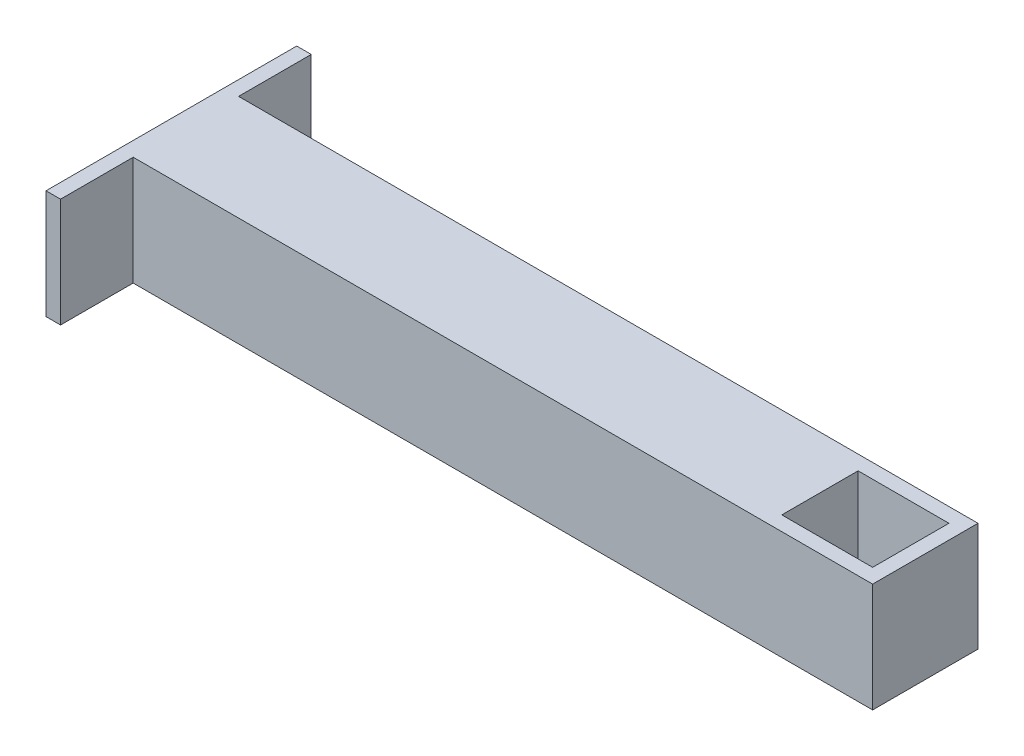
ISO-10303-21;
HEADER;
FILE_DESCRIPTION(('STEP AP214'),'2;1');
FILE_NAME('part.step','',(''),(''),'','','');
FILE_SCHEMA(('AUTOMOTIVE_DESIGN { 1 0 10303 214 1 1 1 1 }'));
ENDSEC;
DATA;
#1=APPLICATION_CONTEXT('core data for automotive mechanical design processes');
#2=APPLICATION_PROTOCOL_DEFINITION('international standard','automotive_design',2000,#1);
#3=PRODUCT_CONTEXT('',#1,'mechanical');
#4=PRODUCT('Part','Part','',(#3));
#5=PRODUCT_RELATED_PRODUCT_CATEGORY('part','',(#4));
#6=PRODUCT_DEFINITION_FORMATION('','',#4);
#7=PRODUCT_DEFINITION_CONTEXT('part definition',#1,'design');
#8=PRODUCT_DEFINITION('design','',#6,#7);
#9=PRODUCT_DEFINITION_SHAPE('','',#8);
#10=(LENGTH_UNIT() NAMED_UNIT(*) SI_UNIT(.MILLI.,.METRE.));
#11=(NAMED_UNIT(*) PLANE_ANGLE_UNIT() SI_UNIT($,.RADIAN.));
#12=(NAMED_UNIT(*) SI_UNIT($,.STERADIAN.) SOLID_ANGLE_UNIT());
#13=UNCERTAINTY_MEASURE_WITH_UNIT(LENGTH_MEASURE(1.E-05),#10,'distance_accuracy_value','');
#14=(GEOMETRIC_REPRESENTATION_CONTEXT(3) GLOBAL_UNCERTAINTY_ASSIGNED_CONTEXT((#13)) GLOBAL_UNIT_ASSIGNED_CONTEXT((#10,
#11,#12)) REPRESENTATION_CONTEXT('',''));
#15=CARTESIAN_POINT('',(0.,0.,0.));
#16=DIRECTION('',(0.,0.,1.));
#17=DIRECTION('',(1.,0.,0.));
#18=AXIS2_PLACEMENT_3D('',#15,#16,#17);
#19=CARTESIAN_POINT('',(-87.25,15.,0.));
#20=DIRECTION('',(-1.,0.,0.));
#21=DIRECTION('',(0.,0.,1.));
#22=AXIS2_PLACEMENT_3D('',#19,#20,#21);
#23=PLANE('',#22);
#24=DIRECTION('',(0.,0.,-1.));
#25=VECTOR('',#24,1.);
#26=CARTESIAN_POINT('',(-87.25,0.,0.));
#27=LINE('',#26,#25);
#28=CARTESIAN_POINT('',(-87.25,0.,22.5));
#29=VERTEX_POINT('',#28);
#30=CARTESIAN_POINT('',(-87.25,0.,12.5));
#31=VERTEX_POINT('',#30);
#32=EDGE_CURVE('E186',#29,#31,#27,.T.);
#33=ORIENTED_EDGE('',*,*,#32,.T.);
#34=DIRECTION('',(0.,-1.,0.));
#35=VECTOR('',#34,1.);
#36=CARTESIAN_POINT('',(-87.25,15.,12.5));
#37=LINE('',#36,#35);
#38=CARTESIAN_POINT('',(-87.25,15.,12.5));
#39=VERTEX_POINT('',#38);
#40=EDGE_CURVE('E11',#39,#31,#37,.T.);
#41=ORIENTED_EDGE('',*,*,#40,.F.);
#42=DIRECTION('',(0.,0.,-1.));
#43=VECTOR('',#42,1.);
#44=CARTESIAN_POINT('',(-87.25,15.,0.));
#45=LINE('',#44,#43);
#46=CARTESIAN_POINT('',(-87.25,15.,22.5));
#47=VERTEX_POINT('',#46);
#48=EDGE_CURVE('E305',#47,#39,#45,.T.);
#49=ORIENTED_EDGE('',*,*,#48,.F.);
#50=DIRECTION('',(0.,-1.,0.));
#51=VECTOR('',#50,1.);
#52=CARTESIAN_POINT('',(-87.25,15.,22.5));
#53=LINE('',#52,#51);
#54=EDGE_CURVE('E212',#47,#29,#53,.T.);
#55=ORIENTED_EDGE('',*,*,#54,.T.);
#56=EDGE_LOOP('',(#33,#41,#49,#55));
#57=FACE_BOUND('',#56,.T.);
#58=ADVANCED_FACE('F39',(#57),#23,.F.);
#59=CARTESIAN_POINT('',(0.,15.,12.5));
#60=DIRECTION('',(0.,0.,-1.));
#61=DIRECTION('',(-1.,0.,0.));
#62=AXIS2_PLACEMENT_3D('',#59,#60,#61);
#63=PLANE('',#62);
#64=DIRECTION('',(1.,0.,0.));
#65=VECTOR('',#64,1.);
#66=CARTESIAN_POINT('',(0.,0.,12.5));
#67=LINE('',#66,#65);
#68=CARTESIAN_POINT('',(14.5,0.,12.5));
#69=VERTEX_POINT('',#68);
#70=EDGE_CURVE('E190',#31,#69,#67,.T.);
#71=ORIENTED_EDGE('',*,*,#70,.T.);
#72=DIRECTION('',(0.,-1.,0.));
#73=VECTOR('',#72,1.);
#74=CARTESIAN_POINT('',(14.5,15.,12.5));
#75=LINE('',#74,#73);
#76=CARTESIAN_POINT('',(14.5,15.,12.5));
#77=VERTEX_POINT('',#76);
#78=EDGE_CURVE('E50',#77,#69,#75,.T.);
#79=ORIENTED_EDGE('',*,*,#78,.F.);
#80=DIRECTION('',(1.,0.,0.));
#81=VECTOR('',#80,1.);
#82=CARTESIAN_POINT('',(0.,15.,12.5));
#83=LINE('',#82,#81);
#84=EDGE_CURVE('E308',#39,#77,#83,.T.);
#85=ORIENTED_EDGE('',*,*,#84,.F.);
#86=ORIENTED_EDGE('',*,*,#40,.T.);
#87=EDGE_LOOP('',(#71,#79,#85,#86));
#88=FACE_BOUND('',#87,.T.);
#89=ADVANCED_FACE('F262',(#88),#63,.F.);
#90=CARTESIAN_POINT('',(14.5,15.,0.));
#91=DIRECTION('',(1.,0.,0.));
#92=DIRECTION('',(0.,0.,-1.));
#93=AXIS2_PLACEMENT_3D('',#90,#91,#92);
#94=PLANE('',#93);
#95=DIRECTION('',(0.,0.,1.));
#96=VECTOR('',#95,1.);
#97=CARTESIAN_POINT('',(14.5,0.,0.));
#98=LINE('',#97,#96);
#99=CARTESIAN_POINT('',(14.5,0.,-2.));
#100=VERTEX_POINT('',#99);
#101=EDGE_CURVE('E194',#100,#69,#98,.T.);
#102=ORIENTED_EDGE('',*,*,#101,.F.);
#103=DIRECTION('',(0.,-1.,0.));
#104=VECTOR('',#103,1.);
#105=CARTESIAN_POINT('',(14.5,15.,-2.));
#106=LINE('',#105,#104);
#107=CARTESIAN_POINT('',(14.5,15.,-2.));
#108=VERTEX_POINT('',#107);
#109=EDGE_CURVE('E222',#108,#100,#106,.T.);
#110=ORIENTED_EDGE('',*,*,#109,.F.);
#111=DIRECTION('',(0.,0.,1.));
#112=VECTOR('',#111,1.);
#113=CARTESIAN_POINT('',(14.5,15.,0.));
#114=LINE('',#113,#112);
#115=EDGE_CURVE('E311',#108,#77,#114,.T.);
#116=ORIENTED_EDGE('',*,*,#115,.T.);
#117=ORIENTED_EDGE('',*,*,#78,.T.);
#118=EDGE_LOOP('',(#102,#110,#116,#117));
#119=FACE_BOUND('',#118,.T.);
#120=ADVANCED_FACE('F268',(#119),#94,.T.);
#121=CARTESIAN_POINT('',(0.,15.,-2.));
#122=DIRECTION('',(0.,0.,-1.));
#123=DIRECTION('',(-1.,0.,0.));
#124=AXIS2_PLACEMENT_3D('',#121,#122,#123);
#125=PLANE('',#124);
#126=DIRECTION('',(1.,0.,0.));
#127=VECTOR('',#126,1.);
#128=CARTESIAN_POINT('',(0.,0.,-2.));
#129=LINE('',#128,#127);
#130=CARTESIAN_POINT('',(-87.25,0.,-2.00000000000001));
#131=VERTEX_POINT('',#130);
#132=EDGE_CURVE('E198',#131,#100,#129,.T.);
#133=ORIENTED_EDGE('',*,*,#132,.F.);
#134=DIRECTION('',(0.,-1.,0.));
#135=VECTOR('',#134,1.);
#136=CARTESIAN_POINT('',(-87.25,15.,-2.00000000000001));
#137=LINE('',#136,#135);
#138=CARTESIAN_POINT('',(-87.25,15.,-2.00000000000001));
#139=VERTEX_POINT('',#138);
#140=EDGE_CURVE('E219',#139,#131,#137,.T.);
#141=ORIENTED_EDGE('',*,*,#140,.F.);
#142=DIRECTION('',(1.,0.,0.));
#143=VECTOR('',#142,1.);
#144=CARTESIAN_POINT('',(0.,15.,-2.));
#145=LINE('',#144,#143);
#146=EDGE_CURVE('E315',#139,#108,#145,.T.);
#147=ORIENTED_EDGE('',*,*,#146,.T.);
#148=ORIENTED_EDGE('',*,*,#109,.T.);
#149=EDGE_LOOP('',(#133,#141,#147,#148));
#150=FACE_BOUND('',#149,.T.);
#151=ADVANCED_FACE('F274',(#150),#125,.T.);
#152=CARTESIAN_POINT('',(-87.25,15.,0.));
#153=DIRECTION('',(-1.,0.,0.));
#154=DIRECTION('',(0.,0.,1.));
#155=AXIS2_PLACEMENT_3D('',#152,#153,#154);
#156=PLANE('',#155);
#157=DIRECTION('',(0.,0.,-1.));
#158=VECTOR('',#157,1.);
#159=CARTESIAN_POINT('',(-87.25,0.,0.));
#160=LINE('',#159,#158);
#161=CARTESIAN_POINT('',(-87.25,0.,-12.));
#162=VERTEX_POINT('',#161);
#163=EDGE_CURVE('E202',#131,#162,#160,.T.);
#164=ORIENTED_EDGE('',*,*,#163,.T.);
#165=DIRECTION('',(0.,-1.,0.));
#166=VECTOR('',#165,1.);
#167=CARTESIAN_POINT('',(-87.25,15.,-12.));
#168=LINE('',#167,#166);
#169=CARTESIAN_POINT('',(-87.25,15.,-12.));
#170=VERTEX_POINT('',#169);
#171=EDGE_CURVE('E159',#170,#162,#168,.T.);
#172=ORIENTED_EDGE('',*,*,#171,.F.);
#173=DIRECTION('',(0.,0.,-1.));
#174=VECTOR('',#173,1.);
#175=CARTESIAN_POINT('',(-87.25,15.,0.));
#176=LINE('',#175,#174);
#177=EDGE_CURVE('E148',#139,#170,#176,.T.);
#178=ORIENTED_EDGE('',*,*,#177,.F.);
#179=ORIENTED_EDGE('',*,*,#140,.T.);
#180=EDGE_LOOP('',(#164,#172,#178,#179));
#181=FACE_BOUND('',#180,.T.);
#182=ADVANCED_FACE('F278',(#181),#156,.F.);
#183=CARTESIAN_POINT('',(0.,15.,-12.));
#184=DIRECTION('',(0.,0.,1.));
#185=DIRECTION('',(1.,0.,0.));
#186=AXIS2_PLACEMENT_3D('',#183,#184,#185);
#187=PLANE('',#186);
#188=DIRECTION('',(-1.,0.,0.));
#189=VECTOR('',#188,1.);
#190=CARTESIAN_POINT('',(0.,0.,-12.));
#191=LINE('',#190,#189);
#192=CARTESIAN_POINT('',(-89.25,0.,-12.));
#193=VERTEX_POINT('',#192);
#194=EDGE_CURVE('E157',#162,#193,#191,.T.);
#195=ORIENTED_EDGE('',*,*,#194,.T.);
#196=DIRECTION('',(0.,-1.,0.));
#197=VECTOR('',#196,1.);
#198=CARTESIAN_POINT('',(-89.25,15.,-12.));
#199=LINE('',#198,#197);
#200=CARTESIAN_POINT('',(-89.25,15.,-12.));
#201=VERTEX_POINT('',#200);
#202=EDGE_CURVE('E154',#201,#193,#199,.T.);
#203=ORIENTED_EDGE('',*,*,#202,.F.);
#204=DIRECTION('',(-1.,0.,0.));
#205=VECTOR('',#204,1.);
#206=CARTESIAN_POINT('',(0.,15.,-12.));
#207=LINE('',#206,#205);
#208=EDGE_CURVE('E141',#170,#201,#207,.T.);
#209=ORIENTED_EDGE('',*,*,#208,.F.);
#210=ORIENTED_EDGE('',*,*,#171,.T.);
#211=EDGE_LOOP('',(#195,#203,#209,#210));
#212=FACE_BOUND('',#211,.T.);
#213=ADVANCED_FACE('F155',(#212),#187,.F.);
#214=CARTESIAN_POINT('',(-89.25,15.,0.));
#215=DIRECTION('',(1.,0.,0.));
#216=DIRECTION('',(0.,0.,-1.));
#217=AXIS2_PLACEMENT_3D('',#214,#215,#216);
#218=PLANE('',#217);
#219=DIRECTION('',(0.,0.,1.));
#220=VECTOR('',#219,1.);
#221=CARTESIAN_POINT('',(-89.25,0.,0.));
#222=LINE('',#221,#220);
#223=CARTESIAN_POINT('',(-89.25,0.,22.5));
#224=VERTEX_POINT('',#223);
#225=EDGE_CURVE('E100',#193,#224,#222,.T.);
#226=ORIENTED_EDGE('',*,*,#225,.T.);
#227=DIRECTION('',(0.,-1.,0.));
#228=VECTOR('',#227,1.);
#229=CARTESIAN_POINT('',(-89.25,15.,22.5));
#230=LINE('',#229,#228);
#231=CARTESIAN_POINT('',(-89.25,15.,22.5));
#232=VERTEX_POINT('',#231);
#233=EDGE_CURVE('E160',#232,#224,#230,.T.);
#234=ORIENTED_EDGE('',*,*,#233,.F.);
#235=DIRECTION('',(0.,0.,1.));
#236=VECTOR('',#235,1.);
#237=CARTESIAN_POINT('',(-89.25,15.,0.));
#238=LINE('',#237,#236);
#239=EDGE_CURVE('E145',#201,#232,#238,.T.);
#240=ORIENTED_EDGE('',*,*,#239,.F.);
#241=ORIENTED_EDGE('',*,*,#202,.T.);
#242=EDGE_LOOP('',(#226,#234,#240,#241));
#243=FACE_BOUND('',#242,.T.);
#244=ADVANCED_FACE('F162',(#243),#218,.F.);
#245=CARTESIAN_POINT('',(0.,15.,0.));
#246=DIRECTION('',(0.,0.,-1.));
#247=DIRECTION('',(-1.,0.,0.));
#248=AXIS2_PLACEMENT_3D('',#245,#246,#247);
#249=PLANE('',#248);
#250=DIRECTION('',(1.,0.,0.));
#251=VECTOR('',#250,1.);
#252=CARTESIAN_POINT('',(0.,0.,0.));
#253=LINE('',#252,#251);
#254=CARTESIAN_POINT('',(0.,0.,0.));
#255=VERTEX_POINT('',#254);
#256=CARTESIAN_POINT('',(12.5,0.,0.));
#257=VERTEX_POINT('',#256);
#258=EDGE_CURVE('E170',#255,#257,#253,.T.);
#259=ORIENTED_EDGE('',*,*,#258,.T.);
#260=DIRECTION('',(0.,-1.,0.));
#261=VECTOR('',#260,1.);
#262=CARTESIAN_POINT('',(12.5,15.,0.));
#263=LINE('',#262,#261);
#264=CARTESIAN_POINT('',(12.5,15.,0.));
#265=VERTEX_POINT('',#264);
#266=EDGE_CURVE('E43',#265,#257,#263,.T.);
#267=ORIENTED_EDGE('',*,*,#266,.F.);
#268=DIRECTION('',(1.,0.,0.));
#269=VECTOR('',#268,1.);
#270=CARTESIAN_POINT('',(0.,15.,0.));
#271=LINE('',#270,#269);
#272=CARTESIAN_POINT('',(0.,15.,0.));
#273=VERTEX_POINT('',#272);
#274=EDGE_CURVE('E211',#273,#265,#271,.T.);
#275=ORIENTED_EDGE('',*,*,#274,.F.);
#276=DIRECTION('',(0.,-1.,0.));
#277=VECTOR('',#276,1.);
#278=CARTESIAN_POINT('',(0.,15.,0.));
#279=LINE('',#278,#277);
#280=EDGE_CURVE('E166',#273,#255,#279,.T.);
#281=ORIENTED_EDGE('',*,*,#280,.T.);
#282=EDGE_LOOP('',(#259,#267,#275,#281));
#283=FACE_BOUND('',#282,.T.);
#284=ADVANCED_FACE('F41',(#283),#249,.F.);
#285=CARTESIAN_POINT('',(12.5,15.,0.));
#286=DIRECTION('',(1.,0.,0.));
#287=DIRECTION('',(0.,0.,-1.));
#288=AXIS2_PLACEMENT_3D('',#285,#286,#287);
#289=PLANE('',#288);
#290=DIRECTION('',(0.,0.,1.));
#291=VECTOR('',#290,1.);
#292=CARTESIAN_POINT('',(12.5,0.,0.));
#293=LINE('',#292,#291);
#294=CARTESIAN_POINT('',(12.5,0.,10.5));
#295=VERTEX_POINT('',#294);
#296=EDGE_CURVE('E174',#257,#295,#293,.T.);
#297=ORIENTED_EDGE('',*,*,#296,.T.);
#298=DIRECTION('',(0.,-1.,0.));
#299=VECTOR('',#298,1.);
#300=CARTESIAN_POINT('',(12.5,15.,10.5));
#301=LINE('',#300,#299);
#302=CARTESIAN_POINT('',(12.5,15.,10.5));
#303=VERTEX_POINT('',#302);
#304=EDGE_CURVE('E231',#303,#295,#301,.T.);
#305=ORIENTED_EDGE('',*,*,#304,.F.);
#306=DIRECTION('',(0.,0.,1.));
#307=VECTOR('',#306,1.);
#308=CARTESIAN_POINT('',(12.5,15.,0.));
#309=LINE('',#308,#307);
#310=EDGE_CURVE('E115',#265,#303,#309,.T.);
#311=ORIENTED_EDGE('',*,*,#310,.F.);
#312=ORIENTED_EDGE('',*,*,#266,.T.);
#313=EDGE_LOOP('',(#297,#305,#311,#312));
#314=FACE_BOUND('',#313,.T.);
#315=ADVANCED_FACE('F238',(#314),#289,.F.);
#316=CARTESIAN_POINT('',(0.,15.,10.5));
#317=DIRECTION('',(0.,0.,-1.));
#318=DIRECTION('',(-1.,0.,0.));
#319=AXIS2_PLACEMENT_3D('',#316,#317,#318);
#320=PLANE('',#319);
#321=DIRECTION('',(1.,0.,0.));
#322=VECTOR('',#321,1.);
#323=CARTESIAN_POINT('',(0.,0.,10.5));
#324=LINE('',#323,#322);
#325=CARTESIAN_POINT('',(0.,0.,10.5));
#326=VERTEX_POINT('',#325);
#327=EDGE_CURVE('E178',#326,#295,#324,.T.);
#328=ORIENTED_EDGE('',*,*,#327,.F.);
#329=DIRECTION('',(0.,-1.,0.));
#330=VECTOR('',#329,1.);
#331=CARTESIAN_POINT('',(0.,15.,10.5));
#332=LINE('',#331,#330);
#333=CARTESIAN_POINT('',(0.,15.,10.5));
#334=VERTEX_POINT('',#333);
#335=EDGE_CURVE('E229',#334,#326,#332,.T.);
#336=ORIENTED_EDGE('',*,*,#335,.F.);
#337=DIRECTION('',(1.,0.,0.));
#338=VECTOR('',#337,1.);
#339=CARTESIAN_POINT('',(0.,15.,10.5));
#340=LINE('',#339,#338);
#341=EDGE_CURVE('E298',#334,#303,#340,.T.);
#342=ORIENTED_EDGE('',*,*,#341,.T.);
#343=ORIENTED_EDGE('',*,*,#304,.T.);
#344=EDGE_LOOP('',(#328,#336,#342,#343));
#345=FACE_BOUND('',#344,.T.);
#346=ADVANCED_FACE('F252',(#345),#320,.T.);
#347=CARTESIAN_POINT('',(0.,15.,0.));
#348=DIRECTION('',(1.,0.,0.));
#349=DIRECTION('',(0.,0.,-1.));
#350=AXIS2_PLACEMENT_3D('',#347,#348,#349);
#351=PLANE('',#350);
#352=DIRECTION('',(0.,0.,1.));
#353=VECTOR('',#352,1.);
#354=CARTESIAN_POINT('',(0.,0.,0.));
#355=LINE('',#354,#353);
#356=EDGE_CURVE('E182',#255,#326,#355,.T.);
#357=ORIENTED_EDGE('',*,*,#356,.F.);
#358=ORIENTED_EDGE('',*,*,#280,.F.);
#359=DIRECTION('',(0.,0.,1.));
#360=VECTOR('',#359,1.);
#361=CARTESIAN_POINT('',(0.,15.,0.));
#362=LINE('',#361,#360);
#363=EDGE_CURVE('E250',#273,#334,#362,.T.);
#364=ORIENTED_EDGE('',*,*,#363,.T.);
#365=ORIENTED_EDGE('',*,*,#335,.T.);
#366=EDGE_LOOP('',(#357,#358,#364,#365));
#367=FACE_BOUND('',#366,.T.);
#368=ADVANCED_FACE('F247',(#367),#351,.T.);
#369=CARTESIAN_POINT('',(0.,15.,22.5));
#370=DIRECTION('',(0.,0.,-1.));
#371=DIRECTION('',(-1.,0.,0.));
#372=AXIS2_PLACEMENT_3D('',#369,#370,#371);
#373=PLANE('',#372);
#374=DIRECTION('',(1.,0.,0.));
#375=VECTOR('',#374,1.);
#376=CARTESIAN_POINT('',(0.,0.,22.5));
#377=LINE('',#376,#375);
#378=EDGE_CURVE('E106',#224,#29,#377,.T.);
#379=ORIENTED_EDGE('',*,*,#378,.T.);
#380=ORIENTED_EDGE('',*,*,#54,.F.);
#381=DIRECTION('',(1.,0.,0.));
#382=VECTOR('',#381,1.);
#383=CARTESIAN_POINT('',(0.,15.,22.5));
#384=LINE('',#383,#382);
#385=EDGE_CURVE('E59',#232,#47,#384,.T.);
#386=ORIENTED_EDGE('',*,*,#385,.F.);
#387=ORIENTED_EDGE('',*,*,#233,.T.);
#388=EDGE_LOOP('',(#379,#380,#386,#387));
#389=FACE_BOUND('',#388,.T.);
#390=ADVANCED_FACE('F259',(#389),#373,.F.);
#391=CARTESIAN_POINT('',(0.,15.,0.));
#392=DIRECTION('',(0.,1.,0.));
#393=DIRECTION('',(0.,0.,1.));
#394=AXIS2_PLACEMENT_3D('',#391,#392,#393);
#395=PLANE('',#394);
#396=ORIENTED_EDGE('',*,*,#274,.T.);
#397=ORIENTED_EDGE('',*,*,#310,.T.);
#398=ORIENTED_EDGE('',*,*,#341,.F.);
#399=ORIENTED_EDGE('',*,*,#363,.F.);
#400=EDGE_LOOP('',(#396,#397,#398,#399));
#401=FACE_BOUND('',#400,.T.);
#402=ORIENTED_EDGE('',*,*,#48,.T.);
#403=ORIENTED_EDGE('',*,*,#84,.T.);
#404=ORIENTED_EDGE('',*,*,#115,.F.);
#405=ORIENTED_EDGE('',*,*,#146,.F.);
#406=ORIENTED_EDGE('',*,*,#177,.T.);
#407=ORIENTED_EDGE('',*,*,#208,.T.);
#408=ORIENTED_EDGE('',*,*,#239,.T.);
#409=ORIENTED_EDGE('',*,*,#385,.T.);
#410=EDGE_LOOP('',(#402,#403,#404,#405,#406,#407,#408,#409));
#411=FACE_BOUND('',#410,.T.);
#412=ADVANCED_FACE('F143',(#401,#411),#395,.T.);
#413=CARTESIAN_POINT('',(0.,0.,0.));
#414=DIRECTION('',(0.,1.,0.));
#415=DIRECTION('',(0.,0.,1.));
#416=AXIS2_PLACEMENT_3D('',#413,#414,#415);
#417=PLANE('',#416);
#418=ORIENTED_EDGE('',*,*,#258,.F.);
#419=ORIENTED_EDGE('',*,*,#356,.T.);
#420=ORIENTED_EDGE('',*,*,#327,.T.);
#421=ORIENTED_EDGE('',*,*,#296,.F.);
#422=EDGE_LOOP('',(#418,#419,#420,#421));
#423=FACE_BOUND('',#422,.T.);
#424=ORIENTED_EDGE('',*,*,#32,.F.);
#425=ORIENTED_EDGE('',*,*,#378,.F.);
#426=ORIENTED_EDGE('',*,*,#225,.F.);
#427=ORIENTED_EDGE('',*,*,#194,.F.);
#428=ORIENTED_EDGE('',*,*,#163,.F.);
#429=ORIENTED_EDGE('',*,*,#132,.T.);
#430=ORIENTED_EDGE('',*,*,#101,.T.);
#431=ORIENTED_EDGE('',*,*,#70,.F.);
#432=EDGE_LOOP('',(#424,#425,#426,#427,#428,#429,#430,#431));
#433=FACE_BOUND('',#432,.T.);
#434=ADVANCED_FACE('F244',(#423,#433),#417,.F.);
#435=CLOSED_SHELL('',(#58,#89,#120,#151,#182,#213,#244,#284,#315,#346,#368,#390,#412,#434));
#436=MANIFOLD_SOLID_BREP('B2',#435);
#437=ADVANCED_BREP_SHAPE_REPRESENTATION('',(#18,#436),#14);
#438=SHAPE_DEFINITION_REPRESENTATION(#9,#437);
ENDSEC;
END-ISO-10303-21;
